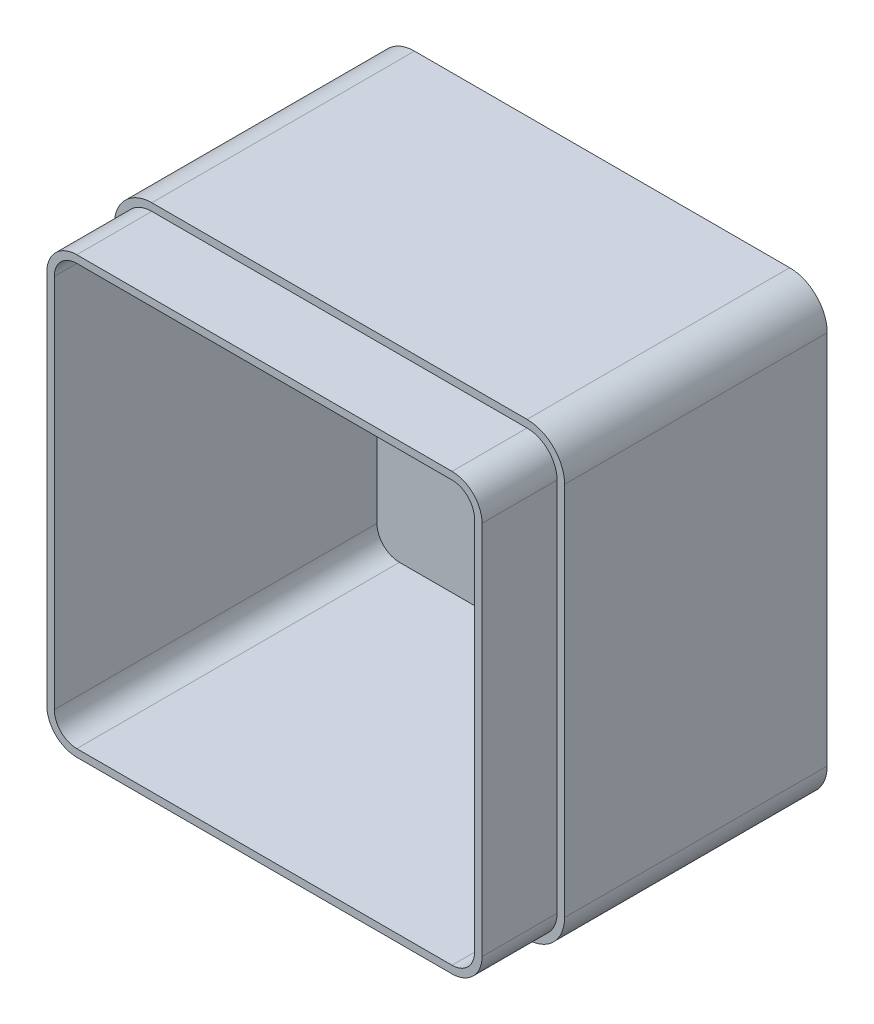
ISO-10303-21;
HEADER;
FILE_DESCRIPTION(('STEP AP214'),'2;1');
FILE_NAME('part.step','',(''),(''),'','','');
FILE_SCHEMA(('AUTOMOTIVE_DESIGN { 1 0 10303 214 1 1 1 1 }'));
ENDSEC;
DATA;
#1=APPLICATION_CONTEXT('core data for automotive mechanical design processes');
#2=APPLICATION_PROTOCOL_DEFINITION('international standard','automotive_design',2000,#1);
#3=PRODUCT_CONTEXT('',#1,'mechanical');
#4=PRODUCT('Part','Part','',(#3));
#5=PRODUCT_RELATED_PRODUCT_CATEGORY('part','',(#4));
#6=PRODUCT_DEFINITION_FORMATION('','',#4);
#7=PRODUCT_DEFINITION_CONTEXT('part definition',#1,'design');
#8=PRODUCT_DEFINITION('design','',#6,#7);
#9=PRODUCT_DEFINITION_SHAPE('','',#8);
#10=(LENGTH_UNIT() NAMED_UNIT(*) SI_UNIT(.MILLI.,.METRE.));
#11=(NAMED_UNIT(*) PLANE_ANGLE_UNIT() SI_UNIT($,.RADIAN.));
#12=(NAMED_UNIT(*) SI_UNIT($,.STERADIAN.) SOLID_ANGLE_UNIT());
#13=UNCERTAINTY_MEASURE_WITH_UNIT(LENGTH_MEASURE(1.E-05),#10,'distance_accuracy_value','');
#14=(GEOMETRIC_REPRESENTATION_CONTEXT(3) GLOBAL_UNCERTAINTY_ASSIGNED_CONTEXT((#13)) GLOBAL_UNIT_ASSIGNED_CONTEXT((#10,
#11,#12)) REPRESENTATION_CONTEXT('',''));
#15=CARTESIAN_POINT('',(0.,0.,0.));
#16=DIRECTION('',(0.,0.,1.));
#17=DIRECTION('',(1.,0.,0.));
#18=AXIS2_PLACEMENT_3D('',#15,#16,#17);
#19=CARTESIAN_POINT('',(0.,0.,90.));
#20=DIRECTION('',(0.,0.,-1.));
#21=DIRECTION('',(-1.,0.,0.));
#22=AXIS2_PLACEMENT_3D('',#19,#20,#21);
#23=PLANE('',#22);
#24=DIRECTION('',(1.,0.,0.));
#25=VECTOR('',#24,1.);
#26=CARTESIAN_POINT('',(0.,4.,90.));
#27=LINE('',#26,#25);
#28=CARTESIAN_POINT('',(10.,4.,90.));
#29=VERTEX_POINT('',#28);
#30=CARTESIAN_POINT('',(110.,4.00000000000001,90.));
#31=VERTEX_POINT('',#30);
#32=EDGE_CURVE('E329',#29,#31,#27,.T.);
#33=ORIENTED_EDGE('',*,*,#32,.F.);
#34=CARTESIAN_POINT('',(9.99999999999999,10.,90.));
#35=DIRECTION('',(0.,0.,-1.));
#36=DIRECTION('',(-1.,0.,0.));
#37=AXIS2_PLACEMENT_3D('',#34,#35,#36);
#38=CIRCLE('',#37,6.);
#39=CARTESIAN_POINT('',(4.,10.,90.));
#40=VERTEX_POINT('',#39);
#41=EDGE_CURVE('E330',#40,#29,#38,.F.);
#42=ORIENTED_EDGE('',*,*,#41,.F.);
#43=DIRECTION('',(0.,-1.,0.));
#44=VECTOR('',#43,1.);
#45=CARTESIAN_POINT('',(4.,0.,90.));
#46=LINE('',#45,#44);
#47=CARTESIAN_POINT('',(3.99999999999997,110.,90.));
#48=VERTEX_POINT('',#47);
#49=EDGE_CURVE('E310',#48,#40,#46,.T.);
#50=ORIENTED_EDGE('',*,*,#49,.F.);
#51=CARTESIAN_POINT('',(9.99999999999997,110.,90.));
#52=DIRECTION('',(0.,0.,-1.));
#53=DIRECTION('',(-1.,0.,0.));
#54=AXIS2_PLACEMENT_3D('',#51,#52,#53);
#55=CIRCLE('',#54,6.);
#56=CARTESIAN_POINT('',(9.99999999999997,116.,90.));
#57=VERTEX_POINT('',#56);
#58=EDGE_CURVE('E332',#57,#48,#55,.F.);
#59=ORIENTED_EDGE('',*,*,#58,.F.);
#60=DIRECTION('',(-1.,0.,0.));
#61=VECTOR('',#60,1.);
#62=CARTESIAN_POINT('',(0.,116.,90.));
#63=LINE('',#62,#61);
#64=CARTESIAN_POINT('',(110.,116.,90.));
#65=VERTEX_POINT('',#64);
#66=EDGE_CURVE('E322',#65,#57,#63,.T.);
#67=ORIENTED_EDGE('',*,*,#66,.F.);
#68=CARTESIAN_POINT('',(110.,110.,90.));
#69=DIRECTION('',(0.,0.,-1.));
#70=DIRECTION('',(-1.,0.,0.));
#71=AXIS2_PLACEMENT_3D('',#68,#69,#70);
#72=CIRCLE('',#71,6.);
#73=CARTESIAN_POINT('',(116.,110.,90.));
#74=VERTEX_POINT('',#73);
#75=EDGE_CURVE('E315',#74,#65,#72,.F.);
#76=ORIENTED_EDGE('',*,*,#75,.F.);
#77=DIRECTION('',(0.,1.,0.));
#78=VECTOR('',#77,1.);
#79=CARTESIAN_POINT('',(116.,0.,90.));
#80=LINE('',#79,#78);
#81=CARTESIAN_POINT('',(116.,10.,90.));
#82=VERTEX_POINT('',#81);
#83=EDGE_CURVE('E335',#82,#74,#80,.T.);
#84=ORIENTED_EDGE('',*,*,#83,.F.);
#85=CARTESIAN_POINT('',(110.,10.,90.));
#86=DIRECTION('',(0.,0.,-1.));
#87=DIRECTION('',(-1.,0.,0.));
#88=AXIS2_PLACEMENT_3D('',#85,#86,#87);
#89=CIRCLE('',#88,6.);
#90=EDGE_CURVE('E293',#31,#82,#89,.F.);
#91=ORIENTED_EDGE('',*,*,#90,.F.);
#92=EDGE_LOOP('',(#33,#42,#50,#59,#67,#76,#84,#91));
#93=FACE_BOUND('',#92,.T.);
#94=CARTESIAN_POINT('',(9.99999999999999,10.,90.));
#95=DIRECTION('',(0.,0.,1.));
#96=DIRECTION('',(1.,0.,0.));
#97=AXIS2_PLACEMENT_3D('',#94,#95,#96);
#98=CIRCLE('',#97,7.99999999999999);
#99=CARTESIAN_POINT('',(2.00000000000001,9.99999999999999,90.));
#100=VERTEX_POINT('',#99);
#101=CARTESIAN_POINT('',(10.,2.,90.));
#102=VERTEX_POINT('',#101);
#103=EDGE_CURVE('E240',#100,#102,#98,.T.);
#104=ORIENTED_EDGE('',*,*,#103,.T.);
#105=DIRECTION('',(1.,0.,0.));
#106=VECTOR('',#105,1.);
#107=CARTESIAN_POINT('',(10.,2.,90.));
#108=LINE('',#107,#106);
#109=CARTESIAN_POINT('',(110.,2.00000000000001,90.));
#110=VERTEX_POINT('',#109);
#111=EDGE_CURVE('E200',#102,#110,#108,.T.);
#112=ORIENTED_EDGE('',*,*,#111,.T.);
#113=CARTESIAN_POINT('',(110.,10.,90.));
#114=DIRECTION('',(0.,0.,1.));
#115=DIRECTION('',(1.,0.,0.));
#116=AXIS2_PLACEMENT_3D('',#113,#114,#115);
#117=CIRCLE('',#116,8.);
#118=CARTESIAN_POINT('',(118.,10.,90.));
#119=VERTEX_POINT('',#118);
#120=EDGE_CURVE('E48',#110,#119,#117,.T.);
#121=ORIENTED_EDGE('',*,*,#120,.T.);
#122=DIRECTION('',(0.,1.,0.));
#123=VECTOR('',#122,1.);
#124=CARTESIAN_POINT('',(118.,10.,90.));
#125=LINE('',#124,#123);
#126=CARTESIAN_POINT('',(118.,110.,90.));
#127=VERTEX_POINT('',#126);
#128=EDGE_CURVE('E244',#119,#127,#125,.T.);
#129=ORIENTED_EDGE('',*,*,#128,.T.);
#130=CARTESIAN_POINT('',(110.,110.,90.));
#131=DIRECTION('',(0.,0.,1.));
#132=DIRECTION('',(1.,0.,0.));
#133=AXIS2_PLACEMENT_3D('',#130,#131,#132);
#134=CIRCLE('',#133,8.00000000000001);
#135=CARTESIAN_POINT('',(110.,118.,90.));
#136=VERTEX_POINT('',#135);
#137=EDGE_CURVE('E247',#127,#136,#134,.T.);
#138=ORIENTED_EDGE('',*,*,#137,.T.);
#139=DIRECTION('',(-1.,0.,0.));
#140=VECTOR('',#139,1.);
#141=CARTESIAN_POINT('',(110.,118.,90.));
#142=LINE('',#141,#140);
#143=CARTESIAN_POINT('',(9.99999999999997,118.,90.));
#144=VERTEX_POINT('',#143);
#145=EDGE_CURVE('E250',#136,#144,#142,.T.);
#146=ORIENTED_EDGE('',*,*,#145,.T.);
#147=CARTESIAN_POINT('',(9.99999999999997,110.,90.));
#148=DIRECTION('',(0.,0.,1.));
#149=DIRECTION('',(1.,0.,0.));
#150=AXIS2_PLACEMENT_3D('',#147,#148,#149);
#151=CIRCLE('',#150,7.99999999999999);
#152=CARTESIAN_POINT('',(1.99999999999998,110.,90.));
#153=VERTEX_POINT('',#152);
#154=EDGE_CURVE('E223',#144,#153,#151,.T.);
#155=ORIENTED_EDGE('',*,*,#154,.T.);
#156=DIRECTION('',(0.,-1.,0.));
#157=VECTOR('',#156,1.);
#158=CARTESIAN_POINT('',(1.99999999999998,110.,90.));
#159=LINE('',#158,#157);
#160=EDGE_CURVE('E220',#153,#100,#159,.T.);
#161=ORIENTED_EDGE('',*,*,#160,.T.);
#162=EDGE_LOOP('',(#104,#112,#121,#129,#138,#146,#155,#161));
#163=FACE_BOUND('',#162,.T.);
#164=ADVANCED_FACE('F33',(#93,#163),#23,.F.);
#165=CARTESIAN_POINT('',(4.,0.,90.));
#166=DIRECTION('',(1.,0.,0.));
#167=DIRECTION('',(0.,1.,0.));
#168=AXIS2_PLACEMENT_3D('',#165,#166,#167);
#169=PLANE('',#168);
#170=DIRECTION('',(0.,-1.,0.));
#171=VECTOR('',#170,1.);
#172=CARTESIAN_POINT('',(4.,0.,4.));
#173=LINE('',#172,#171);
#174=CARTESIAN_POINT('',(3.99999999999997,110.,4.));
#175=VERTEX_POINT('',#174);
#176=CARTESIAN_POINT('',(4.,10.,4.));
#177=VERTEX_POINT('',#176);
#178=EDGE_CURVE('E282',#175,#177,#173,.T.);
#179=ORIENTED_EDGE('',*,*,#178,.F.);
#180=DIRECTION('',(0.,0.,1.));
#181=VECTOR('',#180,1.);
#182=CARTESIAN_POINT('',(3.99999999999997,110.,90.));
#183=LINE('',#182,#181);
#184=EDGE_CURVE('E290',#48,#175,#183,.F.);
#185=ORIENTED_EDGE('',*,*,#184,.F.);
#186=ORIENTED_EDGE('',*,*,#49,.T.);
#187=DIRECTION('',(0.,0.,1.));
#188=VECTOR('',#187,1.);
#189=CARTESIAN_POINT('',(4.,10.,90.));
#190=LINE('',#189,#188);
#191=EDGE_CURVE('E286',#177,#40,#190,.T.);
#192=ORIENTED_EDGE('',*,*,#191,.F.);
#193=EDGE_LOOP('',(#179,#185,#186,#192));
#194=FACE_BOUND('',#193,.T.);
#195=ADVANCED_FACE('F426',(#194),#169,.T.);
#196=CARTESIAN_POINT('',(0.,4.,90.));
#197=DIRECTION('',(0.,1.,0.));
#198=DIRECTION('',(-1.,0.,0.));
#199=AXIS2_PLACEMENT_3D('',#196,#197,#198);
#200=PLANE('',#199);
#201=DIRECTION('',(1.,0.,0.));
#202=VECTOR('',#201,1.);
#203=CARTESIAN_POINT('',(0.,4.,4.));
#204=LINE('',#203,#202);
#205=CARTESIAN_POINT('',(10.,4.,4.));
#206=VERTEX_POINT('',#205);
#207=CARTESIAN_POINT('',(110.,4.00000000000001,4.));
#208=VERTEX_POINT('',#207);
#209=EDGE_CURVE('E285',#206,#208,#204,.T.);
#210=ORIENTED_EDGE('',*,*,#209,.F.);
#211=DIRECTION('',(0.,0.,1.));
#212=VECTOR('',#211,1.);
#213=CARTESIAN_POINT('',(10.,4.,90.));
#214=LINE('',#213,#212);
#215=EDGE_CURVE('E300',#29,#206,#214,.F.);
#216=ORIENTED_EDGE('',*,*,#215,.F.);
#217=ORIENTED_EDGE('',*,*,#32,.T.);
#218=DIRECTION('',(0.,0.,1.));
#219=VECTOR('',#218,1.);
#220=CARTESIAN_POINT('',(110.,4.00000000000001,90.));
#221=LINE('',#220,#219);
#222=EDGE_CURVE('E313',#208,#31,#221,.T.);
#223=ORIENTED_EDGE('',*,*,#222,.F.);
#224=EDGE_LOOP('',(#210,#216,#217,#223));
#225=FACE_BOUND('',#224,.T.);
#226=ADVANCED_FACE('F432',(#225),#200,.T.);
#227=CARTESIAN_POINT('',(116.,0.,90.));
#228=DIRECTION('',(-1.,0.,0.));
#229=DIRECTION('',(0.,-1.,0.));
#230=AXIS2_PLACEMENT_3D('',#227,#228,#229);
#231=PLANE('',#230);
#232=ORIENTED_EDGE('',*,*,#83,.T.);
#233=DIRECTION('',(0.,0.,1.));
#234=VECTOR('',#233,1.);
#235=CARTESIAN_POINT('',(116.,110.,90.));
#236=LINE('',#235,#234);
#237=CARTESIAN_POINT('',(116.,110.,4.));
#238=VERTEX_POINT('',#237);
#239=EDGE_CURVE('E320',#238,#74,#236,.T.);
#240=ORIENTED_EDGE('',*,*,#239,.F.);
#241=DIRECTION('',(0.,1.,0.));
#242=VECTOR('',#241,1.);
#243=CARTESIAN_POINT('',(116.,0.,4.));
#244=LINE('',#243,#242);
#245=CARTESIAN_POINT('',(116.,10.,4.));
#246=VERTEX_POINT('',#245);
#247=EDGE_CURVE('E294',#246,#238,#244,.T.);
#248=ORIENTED_EDGE('',*,*,#247,.F.);
#249=DIRECTION('',(0.,0.,1.));
#250=VECTOR('',#249,1.);
#251=CARTESIAN_POINT('',(116.,10.,90.));
#252=LINE('',#251,#250);
#253=EDGE_CURVE('E312',#82,#246,#252,.F.);
#254=ORIENTED_EDGE('',*,*,#253,.F.);
#255=EDGE_LOOP('',(#232,#240,#248,#254));
#256=FACE_BOUND('',#255,.T.);
#257=ADVANCED_FACE('F626',(#256),#231,.T.);
#258=CARTESIAN_POINT('',(0.,116.,90.));
#259=DIRECTION('',(0.,-1.,0.));
#260=DIRECTION('',(0.,0.,-1.));
#261=AXIS2_PLACEMENT_3D('',#258,#259,#260);
#262=PLANE('',#261);
#263=DIRECTION('',(-1.,0.,0.));
#264=VECTOR('',#263,1.);
#265=CARTESIAN_POINT('',(0.,116.,4.));
#266=LINE('',#265,#264);
#267=CARTESIAN_POINT('',(110.,116.,4.));
#268=VERTEX_POINT('',#267);
#269=CARTESIAN_POINT('',(9.99999999999997,116.,4.));
#270=VERTEX_POINT('',#269);
#271=EDGE_CURVE('E297',#268,#270,#266,.T.);
#272=ORIENTED_EDGE('',*,*,#271,.F.);
#273=DIRECTION('',(0.,0.,-1.));
#274=VECTOR('',#273,1.);
#275=CARTESIAN_POINT('',(110.,116.,90.));
#276=LINE('',#275,#274);
#277=EDGE_CURVE('E289',#65,#268,#276,.T.);
#278=ORIENTED_EDGE('',*,*,#277,.F.);
#279=ORIENTED_EDGE('',*,*,#66,.T.);
#280=DIRECTION('',(0.,0.,-1.));
#281=VECTOR('',#280,1.);
#282=CARTESIAN_POINT('',(9.99999999999997,116.,90.));
#283=LINE('',#282,#281);
#284=EDGE_CURVE('E325',#270,#57,#283,.F.);
#285=ORIENTED_EDGE('',*,*,#284,.F.);
#286=EDGE_LOOP('',(#272,#278,#279,#285));
#287=FACE_BOUND('',#286,.T.);
#288=ADVANCED_FACE('F616',(#287),#262,.T.);
#289=CARTESIAN_POINT('',(0.,0.,4.));
#290=DIRECTION('',(0.,0.,-1.));
#291=DIRECTION('',(-1.,0.,0.));
#292=AXIS2_PLACEMENT_3D('',#289,#290,#291);
#293=PLANE('',#292);
#294=ORIENTED_EDGE('',*,*,#247,.T.);
#295=CARTESIAN_POINT('',(110.,110.,4.));
#296=DIRECTION('',(0.,0.,-1.));
#297=DIRECTION('',(-1.,0.,0.));
#298=AXIS2_PLACEMENT_3D('',#295,#296,#297);
#299=CIRCLE('',#298,6.);
#300=EDGE_CURVE('E307',#268,#238,#299,.T.);
#301=ORIENTED_EDGE('',*,*,#300,.F.);
#302=ORIENTED_EDGE('',*,*,#271,.T.);
#303=CARTESIAN_POINT('',(9.99999999999997,110.,4.));
#304=DIRECTION('',(0.,0.,-1.));
#305=DIRECTION('',(-1.,0.,0.));
#306=AXIS2_PLACEMENT_3D('',#303,#304,#305);
#307=CIRCLE('',#306,6.);
#308=EDGE_CURVE('E305',#175,#270,#307,.T.);
#309=ORIENTED_EDGE('',*,*,#308,.F.);
#310=ORIENTED_EDGE('',*,*,#178,.T.);
#311=CARTESIAN_POINT('',(9.99999999999999,10.,4.));
#312=DIRECTION('',(0.,0.,-1.));
#313=DIRECTION('',(-1.,0.,0.));
#314=AXIS2_PLACEMENT_3D('',#311,#312,#313);
#315=CIRCLE('',#314,6.);
#316=EDGE_CURVE('E301',#206,#177,#315,.T.);
#317=ORIENTED_EDGE('',*,*,#316,.F.);
#318=ORIENTED_EDGE('',*,*,#209,.T.);
#319=CARTESIAN_POINT('',(110.,10.,4.));
#320=DIRECTION('',(0.,0.,-1.));
#321=DIRECTION('',(-1.,0.,0.));
#322=AXIS2_PLACEMENT_3D('',#319,#320,#321);
#323=CIRCLE('',#322,6.);
#324=EDGE_CURVE('E298',#246,#208,#323,.T.);
#325=ORIENTED_EDGE('',*,*,#324,.F.);
#326=EDGE_LOOP('',(#294,#301,#302,#309,#310,#317,#318,#325));
#327=FACE_BOUND('',#326,.T.);
#328=ADVANCED_FACE('F606',(#327),#293,.F.);
#329=CARTESIAN_POINT('',(110.,10.,90.));
#330=DIRECTION('',(0.,0.,-1.));
#331=DIRECTION('',(-1.,0.,0.));
#332=AXIS2_PLACEMENT_3D('',#329,#330,#331);
#333=CYLINDRICAL_SURFACE('',#332,6.);
#334=ORIENTED_EDGE('',*,*,#90,.T.);
#335=ORIENTED_EDGE('',*,*,#253,.T.);
#336=ORIENTED_EDGE('',*,*,#324,.T.);
#337=ORIENTED_EDGE('',*,*,#222,.T.);
#338=EDGE_LOOP('',(#334,#335,#336,#337));
#339=FACE_BOUND('',#338,.T.);
#340=ADVANCED_FACE('F596',(#339),#333,.F.);
#341=CARTESIAN_POINT('',(9.99999999999999,10.,90.));
#342=DIRECTION('',(0.,0.,-1.));
#343=DIRECTION('',(-1.,0.,0.));
#344=AXIS2_PLACEMENT_3D('',#341,#342,#343);
#345=CYLINDRICAL_SURFACE('',#344,6.);
#346=ORIENTED_EDGE('',*,*,#41,.T.);
#347=ORIENTED_EDGE('',*,*,#215,.T.);
#348=ORIENTED_EDGE('',*,*,#316,.T.);
#349=ORIENTED_EDGE('',*,*,#191,.T.);
#350=EDGE_LOOP('',(#346,#347,#348,#349));
#351=FACE_BOUND('',#350,.T.);
#352=ADVANCED_FACE('F587',(#351),#345,.F.);
#353=CARTESIAN_POINT('',(9.99999999999997,110.,90.));
#354=DIRECTION('',(0.,0.,-1.));
#355=DIRECTION('',(-1.,0.,0.));
#356=AXIS2_PLACEMENT_3D('',#353,#354,#355);
#357=CYLINDRICAL_SURFACE('',#356,6.);
#358=ORIENTED_EDGE('',*,*,#58,.T.);
#359=ORIENTED_EDGE('',*,*,#184,.T.);
#360=ORIENTED_EDGE('',*,*,#308,.T.);
#361=ORIENTED_EDGE('',*,*,#284,.T.);
#362=EDGE_LOOP('',(#358,#359,#360,#361));
#363=FACE_BOUND('',#362,.T.);
#364=ADVANCED_FACE('F578',(#363),#357,.F.);
#365=CARTESIAN_POINT('',(110.,110.,90.));
#366=DIRECTION('',(0.,0.,-1.));
#367=DIRECTION('',(-1.,0.,0.));
#368=AXIS2_PLACEMENT_3D('',#365,#366,#367);
#369=CYLINDRICAL_SURFACE('',#368,6.);
#370=ORIENTED_EDGE('',*,*,#75,.T.);
#371=ORIENTED_EDGE('',*,*,#277,.T.);
#372=ORIENTED_EDGE('',*,*,#300,.T.);
#373=ORIENTED_EDGE('',*,*,#239,.T.);
#374=EDGE_LOOP('',(#370,#371,#372,#373));
#375=FACE_BOUND('',#374,.T.);
#376=ADVANCED_FACE('F439',(#375),#369,.F.);
#377=CARTESIAN_POINT('',(9.99999999999999,10.,70.));
#378=DIRECTION('',(0.,0.,1.));
#379=DIRECTION('',(1.,0.,0.));
#380=AXIS2_PLACEMENT_3D('',#377,#378,#379);
#381=PLANE('',#380);
#382=DIRECTION('',(0.,-1.,0.));
#383=VECTOR('',#382,1.);
#384=CARTESIAN_POINT('',(1.99999999999998,110.,70.));
#385=LINE('',#384,#383);
#386=CARTESIAN_POINT('',(1.99999999999998,110.,70.));
#387=VERTEX_POINT('',#386);
#388=CARTESIAN_POINT('',(2.00000000000001,9.99999999999999,70.));
#389=VERTEX_POINT('',#388);
#390=EDGE_CURVE('E206',#387,#389,#385,.T.);
#391=ORIENTED_EDGE('',*,*,#390,.F.);
#392=CARTESIAN_POINT('',(9.99999999999997,110.,70.));
#393=DIRECTION('',(0.,0.,1.));
#394=DIRECTION('',(1.,0.,0.));
#395=AXIS2_PLACEMENT_3D('',#392,#393,#394);
#396=CIRCLE('',#395,7.99999999999999);
#397=CARTESIAN_POINT('',(9.99999999999997,118.,70.));
#398=VERTEX_POINT('',#397);
#399=EDGE_CURVE('E236',#398,#387,#396,.T.);
#400=ORIENTED_EDGE('',*,*,#399,.F.);
#401=DIRECTION('',(-1.,0.,0.));
#402=VECTOR('',#401,1.);
#403=CARTESIAN_POINT('',(110.,118.,70.));
#404=LINE('',#403,#402);
#405=CARTESIAN_POINT('',(110.,118.,70.));
#406=VERTEX_POINT('',#405);
#407=EDGE_CURVE('E233',#406,#398,#404,.T.);
#408=ORIENTED_EDGE('',*,*,#407,.F.);
#409=CARTESIAN_POINT('',(110.,110.,70.));
#410=DIRECTION('',(0.,0.,1.));
#411=DIRECTION('',(1.,0.,0.));
#412=AXIS2_PLACEMENT_3D('',#409,#410,#411);
#413=CIRCLE('',#412,8.00000000000001);
#414=CARTESIAN_POINT('',(118.,110.,70.));
#415=VERTEX_POINT('',#414);
#416=EDGE_CURVE('E230',#415,#406,#413,.T.);
#417=ORIENTED_EDGE('',*,*,#416,.F.);
#418=DIRECTION('',(0.,1.,0.));
#419=VECTOR('',#418,1.);
#420=CARTESIAN_POINT('',(118.,10.,70.));
#421=LINE('',#420,#419);
#422=CARTESIAN_POINT('',(118.,10.,70.));
#423=VERTEX_POINT('',#422);
#424=EDGE_CURVE('E227',#423,#415,#421,.T.);
#425=ORIENTED_EDGE('',*,*,#424,.F.);
#426=CARTESIAN_POINT('',(110.,10.,70.));
#427=DIRECTION('',(0.,0.,1.));
#428=DIRECTION('',(1.,0.,0.));
#429=AXIS2_PLACEMENT_3D('',#426,#427,#428);
#430=CIRCLE('',#429,8.);
#431=CARTESIAN_POINT('',(110.,2.00000000000001,70.));
#432=VERTEX_POINT('',#431);
#433=EDGE_CURVE('E216',#432,#423,#430,.T.);
#434=ORIENTED_EDGE('',*,*,#433,.F.);
#435=DIRECTION('',(1.,0.,0.));
#436=VECTOR('',#435,1.);
#437=CARTESIAN_POINT('',(10.,2.,70.));
#438=LINE('',#437,#436);
#439=CARTESIAN_POINT('',(10.,2.,70.));
#440=VERTEX_POINT('',#439);
#441=EDGE_CURVE('E198',#440,#432,#438,.T.);
#442=ORIENTED_EDGE('',*,*,#441,.F.);
#443=CARTESIAN_POINT('',(9.99999999999999,10.,70.));
#444=DIRECTION('',(0.,0.,1.));
#445=DIRECTION('',(1.,0.,0.));
#446=AXIS2_PLACEMENT_3D('',#443,#444,#445);
#447=CIRCLE('',#446,7.99999999999999);
#448=EDGE_CURVE('E212',#389,#440,#447,.T.);
#449=ORIENTED_EDGE('',*,*,#448,.F.);
#450=EDGE_LOOP('',(#391,#400,#408,#417,#425,#434,#442,#449));
#451=FACE_BOUND('',#450,.T.);
#452=CARTESIAN_POINT('',(9.99999999999999,10.,70.));
#453=DIRECTION('',(0.,0.,1.));
#454=DIRECTION('',(1.,0.,0.));
#455=AXIS2_PLACEMENT_3D('',#452,#453,#454);
#456=CIRCLE('',#455,10.);
#457=CARTESIAN_POINT('',(0.,9.99999999999999,70.));
#458=VERTEX_POINT('',#457);
#459=CARTESIAN_POINT('',(10.,0.,70.));
#460=VERTEX_POINT('',#459);
#461=EDGE_CURVE('E256',#458,#460,#456,.T.);
#462=ORIENTED_EDGE('',*,*,#461,.T.);
#463=DIRECTION('',(1.,0.,0.));
#464=VECTOR('',#463,1.);
#465=CARTESIAN_POINT('',(10.,0.,70.));
#466=LINE('',#465,#464);
#467=CARTESIAN_POINT('',(110.,0.,70.));
#468=VERTEX_POINT('',#467);
#469=EDGE_CURVE('E269',#460,#468,#466,.T.);
#470=ORIENTED_EDGE('',*,*,#469,.T.);
#471=CARTESIAN_POINT('',(110.,10.,70.));
#472=DIRECTION('',(0.,0.,1.));
#473=DIRECTION('',(1.,0.,0.));
#474=AXIS2_PLACEMENT_3D('',#471,#472,#473);
#475=CIRCLE('',#474,9.99999999999999);
#476=CARTESIAN_POINT('',(120.,10.,70.));
#477=VERTEX_POINT('',#476);
#478=EDGE_CURVE('E271',#468,#477,#475,.T.);
#479=ORIENTED_EDGE('',*,*,#478,.T.);
#480=DIRECTION('',(0.,1.,0.));
#481=VECTOR('',#480,1.);
#482=CARTESIAN_POINT('',(120.,10.,70.));
#483=LINE('',#482,#481);
#484=CARTESIAN_POINT('',(120.,110.,70.));
#485=VERTEX_POINT('',#484);
#486=EDGE_CURVE('E56',#477,#485,#483,.T.);
#487=ORIENTED_EDGE('',*,*,#486,.T.);
#488=CARTESIAN_POINT('',(110.,110.,70.));
#489=DIRECTION('',(0.,0.,1.));
#490=DIRECTION('',(1.,0.,0.));
#491=AXIS2_PLACEMENT_3D('',#488,#489,#490);
#492=CIRCLE('',#491,9.99999999999999);
#493=CARTESIAN_POINT('',(110.,120.,70.));
#494=VERTEX_POINT('',#493);
#495=EDGE_CURVE('E274',#485,#494,#492,.T.);
#496=ORIENTED_EDGE('',*,*,#495,.T.);
#497=DIRECTION('',(-1.,0.,0.));
#498=VECTOR('',#497,1.);
#499=CARTESIAN_POINT('',(110.,120.,70.));
#500=LINE('',#499,#498);
#501=CARTESIAN_POINT('',(9.99999999999997,120.,70.));
#502=VERTEX_POINT('',#501);
#503=EDGE_CURVE('E276',#494,#502,#500,.T.);
#504=ORIENTED_EDGE('',*,*,#503,.T.);
#505=CARTESIAN_POINT('',(9.99999999999997,110.,70.));
#506=DIRECTION('',(0.,0.,1.));
#507=DIRECTION('',(1.,0.,0.));
#508=AXIS2_PLACEMENT_3D('',#505,#506,#507);
#509=CIRCLE('',#508,9.99999999999999);
#510=CARTESIAN_POINT('',(0.,110.,70.));
#511=VERTEX_POINT('',#510);
#512=EDGE_CURVE('E278',#502,#511,#509,.T.);
#513=ORIENTED_EDGE('',*,*,#512,.T.);
#514=DIRECTION('',(0.,-1.,0.));
#515=VECTOR('',#514,1.);
#516=CARTESIAN_POINT('',(0.,110.,70.));
#517=LINE('',#516,#515);
#518=EDGE_CURVE('E280',#511,#458,#517,.T.);
#519=ORIENTED_EDGE('',*,*,#518,.T.);
#520=EDGE_LOOP('',(#462,#470,#479,#487,#496,#504,#513,#519));
#521=FACE_BOUND('',#520,.T.);
#522=ADVANCED_FACE('F211',(#451,#521),#381,.T.);
#523=CARTESIAN_POINT('',(9.99999999999999,10.,70.));
#524=DIRECTION('',(0.,0.,1.));
#525=DIRECTION('',(1.,0.,0.));
#526=AXIS2_PLACEMENT_3D('',#523,#524,#525);
#527=CYLINDRICAL_SURFACE('',#526,7.99999999999999);
#528=ORIENTED_EDGE('',*,*,#103,.F.);
#529=DIRECTION('',(0.,0.,1.));
#530=VECTOR('',#529,1.);
#531=CARTESIAN_POINT('',(2.00000000000001,9.99999999999999,70.));
#532=LINE('',#531,#530);
#533=EDGE_CURVE('E219',#389,#100,#532,.T.);
#534=ORIENTED_EDGE('',*,*,#533,.F.);
#535=ORIENTED_EDGE('',*,*,#448,.T.);
#536=DIRECTION('',(0.,0.,1.));
#537=VECTOR('',#536,1.);
#538=CARTESIAN_POINT('',(10.,2.,70.));
#539=LINE('',#538,#537);
#540=EDGE_CURVE('E195',#440,#102,#539,.T.);
#541=ORIENTED_EDGE('',*,*,#540,.T.);
#542=EDGE_LOOP('',(#528,#534,#535,#541));
#543=FACE_BOUND('',#542,.T.);
#544=ADVANCED_FACE('F218',(#543),#527,.T.);
#545=CARTESIAN_POINT('',(1.99999999999998,110.,70.));
#546=DIRECTION('',(-1.,0.,0.));
#547=DIRECTION('',(0.,-1.,0.));
#548=AXIS2_PLACEMENT_3D('',#545,#546,#547);
#549=PLANE('',#548);
#550=ORIENTED_EDGE('',*,*,#160,.F.);
#551=DIRECTION('',(0.,0.,1.));
#552=VECTOR('',#551,1.);
#553=CARTESIAN_POINT('',(1.99999999999998,110.,70.));
#554=LINE('',#553,#552);
#555=EDGE_CURVE('E257',#387,#153,#554,.T.);
#556=ORIENTED_EDGE('',*,*,#555,.F.);
#557=ORIENTED_EDGE('',*,*,#390,.T.);
#558=ORIENTED_EDGE('',*,*,#533,.T.);
#559=EDGE_LOOP('',(#550,#556,#557,#558));
#560=FACE_BOUND('',#559,.T.);
#561=ADVANCED_FACE('F482',(#560),#549,.T.);
#562=CARTESIAN_POINT('',(9.99999999999997,110.,70.));
#563=DIRECTION('',(0.,0.,1.));
#564=DIRECTION('',(1.,0.,0.));
#565=AXIS2_PLACEMENT_3D('',#562,#563,#564);
#566=CYLINDRICAL_SURFACE('',#565,7.99999999999999);
#567=ORIENTED_EDGE('',*,*,#154,.F.);
#568=DIRECTION('',(0.,0.,1.));
#569=VECTOR('',#568,1.);
#570=CARTESIAN_POINT('',(9.99999999999997,118.,70.));
#571=LINE('',#570,#569);
#572=EDGE_CURVE('E259',#398,#144,#571,.T.);
#573=ORIENTED_EDGE('',*,*,#572,.F.);
#574=ORIENTED_EDGE('',*,*,#399,.T.);
#575=ORIENTED_EDGE('',*,*,#555,.T.);
#576=EDGE_LOOP('',(#567,#573,#574,#575));
#577=FACE_BOUND('',#576,.T.);
#578=ADVANCED_FACE('F490',(#577),#566,.T.);
#579=CARTESIAN_POINT('',(110.,118.,70.));
#580=DIRECTION('',(0.,1.,0.));
#581=DIRECTION('',(0.,0.,1.));
#582=AXIS2_PLACEMENT_3D('',#579,#580,#581);
#583=PLANE('',#582);
#584=ORIENTED_EDGE('',*,*,#145,.F.);
#585=DIRECTION('',(0.,0.,1.));
#586=VECTOR('',#585,1.);
#587=CARTESIAN_POINT('',(110.,118.,70.));
#588=LINE('',#587,#586);
#589=EDGE_CURVE('E261',#406,#136,#588,.T.);
#590=ORIENTED_EDGE('',*,*,#589,.F.);
#591=ORIENTED_EDGE('',*,*,#407,.T.);
#592=ORIENTED_EDGE('',*,*,#572,.T.);
#593=EDGE_LOOP('',(#584,#590,#591,#592));
#594=FACE_BOUND('',#593,.T.);
#595=ADVANCED_FACE('F499',(#594),#583,.T.);
#596=CARTESIAN_POINT('',(110.,110.,70.));
#597=DIRECTION('',(0.,0.,1.));
#598=DIRECTION('',(1.,0.,0.));
#599=AXIS2_PLACEMENT_3D('',#596,#597,#598);
#600=CYLINDRICAL_SURFACE('',#599,8.00000000000001);
#601=ORIENTED_EDGE('',*,*,#137,.F.);
#602=DIRECTION('',(0.,0.,1.));
#603=VECTOR('',#602,1.);
#604=CARTESIAN_POINT('',(118.,110.,70.));
#605=LINE('',#604,#603);
#606=EDGE_CURVE('E263',#415,#127,#605,.T.);
#607=ORIENTED_EDGE('',*,*,#606,.F.);
#608=ORIENTED_EDGE('',*,*,#416,.T.);
#609=ORIENTED_EDGE('',*,*,#589,.T.);
#610=EDGE_LOOP('',(#601,#607,#608,#609));
#611=FACE_BOUND('',#610,.T.);
#612=ADVANCED_FACE('F508',(#611),#600,.T.);
#613=CARTESIAN_POINT('',(118.,10.,70.));
#614=DIRECTION('',(1.,0.,0.));
#615=DIRECTION('',(0.,0.,-1.));
#616=AXIS2_PLACEMENT_3D('',#613,#614,#615);
#617=PLANE('',#616);
#618=ORIENTED_EDGE('',*,*,#128,.F.);
#619=DIRECTION('',(0.,0.,1.));
#620=VECTOR('',#619,1.);
#621=CARTESIAN_POINT('',(118.,10.,70.));
#622=LINE('',#621,#620);
#623=EDGE_CURVE('E265',#423,#119,#622,.T.);
#624=ORIENTED_EDGE('',*,*,#623,.F.);
#625=ORIENTED_EDGE('',*,*,#424,.T.);
#626=ORIENTED_EDGE('',*,*,#606,.T.);
#627=EDGE_LOOP('',(#618,#624,#625,#626));
#628=FACE_BOUND('',#627,.T.);
#629=ADVANCED_FACE('F517',(#628),#617,.T.);
#630=CARTESIAN_POINT('',(110.,10.,70.));
#631=DIRECTION('',(0.,0.,1.));
#632=DIRECTION('',(1.,0.,0.));
#633=AXIS2_PLACEMENT_3D('',#630,#631,#632);
#634=CYLINDRICAL_SURFACE('',#633,8.);
#635=ORIENTED_EDGE('',*,*,#120,.F.);
#636=DIRECTION('',(0.,0.,1.));
#637=VECTOR('',#636,1.);
#638=CARTESIAN_POINT('',(110.,2.00000000000001,70.));
#639=LINE('',#638,#637);
#640=EDGE_CURVE('E205',#432,#110,#639,.T.);
#641=ORIENTED_EDGE('',*,*,#640,.F.);
#642=ORIENTED_EDGE('',*,*,#433,.T.);
#643=ORIENTED_EDGE('',*,*,#623,.T.);
#644=EDGE_LOOP('',(#635,#641,#642,#643));
#645=FACE_BOUND('',#644,.T.);
#646=ADVANCED_FACE('F526',(#645),#634,.T.);
#647=CARTESIAN_POINT('',(10.,2.,70.));
#648=DIRECTION('',(0.,-1.,0.));
#649=DIRECTION('',(1.,0.,0.));
#650=AXIS2_PLACEMENT_3D('',#647,#648,#649);
#651=PLANE('',#650);
#652=ORIENTED_EDGE('',*,*,#111,.F.);
#653=ORIENTED_EDGE('',*,*,#540,.F.);
#654=ORIENTED_EDGE('',*,*,#441,.T.);
#655=ORIENTED_EDGE('',*,*,#640,.T.);
#656=EDGE_LOOP('',(#652,#653,#654,#655));
#657=FACE_BOUND('',#656,.T.);
#658=ADVANCED_FACE('F197',(#657),#651,.T.);
#659=CARTESIAN_POINT('',(0.,0.,0.));
#660=DIRECTION('',(0.,0.,-1.));
#661=DIRECTION('',(-1.,0.,0.));
#662=AXIS2_PLACEMENT_3D('',#659,#660,#661);
#663=PLANE('',#662);
#664=DIRECTION('',(0.,1.,0.));
#665=VECTOR('',#664,1.);
#666=CARTESIAN_POINT('',(120.,0.,0.));
#667=LINE('',#666,#665);
#668=CARTESIAN_POINT('',(120.,10.,0.));
#669=VERTEX_POINT('',#668);
#670=CARTESIAN_POINT('',(120.,110.,0.));
#671=VERTEX_POINT('',#670);
#672=EDGE_CURVE('E348',#669,#671,#667,.T.);
#673=ORIENTED_EDGE('',*,*,#672,.F.);
#674=CARTESIAN_POINT('',(110.,10.,0.));
#675=DIRECTION('',(0.,0.,-1.));
#676=DIRECTION('',(-1.,0.,0.));
#677=AXIS2_PLACEMENT_3D('',#674,#675,#676);
#678=CIRCLE('',#677,10.);
#679=CARTESIAN_POINT('',(110.,0.,0.));
#680=VERTEX_POINT('',#679);
#681=EDGE_CURVE('E365',#669,#680,#678,.T.);
#682=ORIENTED_EDGE('',*,*,#681,.T.);
#683=DIRECTION('',(1.,0.,0.));
#684=VECTOR('',#683,1.);
#685=CARTESIAN_POINT('',(0.,0.,0.));
#686=LINE('',#685,#684);
#687=CARTESIAN_POINT('',(10.,0.,0.));
#688=VERTEX_POINT('',#687);
#689=EDGE_CURVE('E345',#688,#680,#686,.T.);
#690=ORIENTED_EDGE('',*,*,#689,.F.);
#691=CARTESIAN_POINT('',(9.99999999999999,10.,0.));
#692=DIRECTION('',(0.,0.,-1.));
#693=DIRECTION('',(-1.,0.,0.));
#694=AXIS2_PLACEMENT_3D('',#691,#692,#693);
#695=CIRCLE('',#694,10.);
#696=CARTESIAN_POINT('',(0.,9.99999999999999,0.));
#697=VERTEX_POINT('',#696);
#698=EDGE_CURVE('E363',#688,#697,#695,.T.);
#699=ORIENTED_EDGE('',*,*,#698,.T.);
#700=DIRECTION('',(0.,-1.,0.));
#701=VECTOR('',#700,1.);
#702=CARTESIAN_POINT('',(0.,0.,0.));
#703=LINE('',#702,#701);
#704=CARTESIAN_POINT('',(0.,110.,0.));
#705=VERTEX_POINT('',#704);
#706=EDGE_CURVE('E327',#705,#697,#703,.T.);
#707=ORIENTED_EDGE('',*,*,#706,.F.);
#708=CARTESIAN_POINT('',(9.99999999999997,110.,0.));
#709=DIRECTION('',(0.,0.,-1.));
#710=DIRECTION('',(-1.,0.,0.));
#711=AXIS2_PLACEMENT_3D('',#708,#709,#710);
#712=CIRCLE('',#711,10.);
#713=CARTESIAN_POINT('',(9.99999999999997,120.,0.));
#714=VERTEX_POINT('',#713);
#715=EDGE_CURVE('E361',#705,#714,#712,.T.);
#716=ORIENTED_EDGE('',*,*,#715,.T.);
#717=DIRECTION('',(-1.,0.,0.));
#718=VECTOR('',#717,1.);
#719=CARTESIAN_POINT('',(0.,120.,0.));
#720=LINE('',#719,#718);
#721=CARTESIAN_POINT('',(110.,120.,0.));
#722=VERTEX_POINT('',#721);
#723=EDGE_CURVE('E351',#722,#714,#720,.T.);
#724=ORIENTED_EDGE('',*,*,#723,.F.);
#725=CARTESIAN_POINT('',(110.,110.,0.));
#726=DIRECTION('',(0.,0.,-1.));
#727=DIRECTION('',(-1.,0.,0.));
#728=AXIS2_PLACEMENT_3D('',#725,#726,#727);
#729=CIRCLE('',#728,10.);
#730=EDGE_CURVE('E359',#722,#671,#729,.T.);
#731=ORIENTED_EDGE('',*,*,#730,.T.);
#732=EDGE_LOOP('',(#673,#682,#690,#699,#707,#716,#724,#731));
#733=FACE_BOUND('',#732,.T.);
#734=ADVANCED_FACE('F387',(#733),#663,.T.);
#735=CARTESIAN_POINT('',(9.99999999999997,110.,90.));
#736=DIRECTION('',(0.,0.,-1.));
#737=DIRECTION('',(-1.,0.,0.));
#738=AXIS2_PLACEMENT_3D('',#735,#736,#737);
#739=CYLINDRICAL_SURFACE('',#738,10.);
#740=DIRECTION('',(0.,0.,-1.));
#741=VECTOR('',#740,1.);
#742=CARTESIAN_POINT('',(0.,110.,90.));
#743=LINE('',#742,#741);
#744=EDGE_CURVE('E372',#511,#705,#743,.T.);
#745=ORIENTED_EDGE('',*,*,#744,.F.);
#746=ORIENTED_EDGE('',*,*,#512,.F.);
#747=DIRECTION('',(0.,0.,-1.));
#748=VECTOR('',#747,1.);
#749=CARTESIAN_POINT('',(9.99999999999997,120.,90.));
#750=LINE('',#749,#748);
#751=EDGE_CURVE('E11',#714,#502,#750,.F.);
#752=ORIENTED_EDGE('',*,*,#751,.F.);
#753=ORIENTED_EDGE('',*,*,#715,.F.);
#754=EDGE_LOOP('',(#745,#746,#752,#753));
#755=FACE_BOUND('',#754,.T.);
#756=ADVANCED_FACE('F392',(#755),#739,.T.);
#757=CARTESIAN_POINT('',(110.,110.,90.));
#758=DIRECTION('',(0.,0.,-1.));
#759=DIRECTION('',(-1.,0.,0.));
#760=AXIS2_PLACEMENT_3D('',#757,#758,#759);
#761=CYLINDRICAL_SURFACE('',#760,10.);
#762=DIRECTION('',(0.,0.,-1.));
#763=VECTOR('',#762,1.);
#764=CARTESIAN_POINT('',(110.,120.,90.));
#765=LINE('',#764,#763);
#766=EDGE_CURVE('E41',#494,#722,#765,.T.);
#767=ORIENTED_EDGE('',*,*,#766,.F.);
#768=ORIENTED_EDGE('',*,*,#495,.F.);
#769=DIRECTION('',(0.,0.,-1.));
#770=VECTOR('',#769,1.);
#771=CARTESIAN_POINT('',(120.,110.,90.));
#772=LINE('',#771,#770);
#773=EDGE_CURVE('E354',#671,#485,#772,.F.);
#774=ORIENTED_EDGE('',*,*,#773,.F.);
#775=ORIENTED_EDGE('',*,*,#730,.F.);
#776=EDGE_LOOP('',(#767,#768,#774,#775));
#777=FACE_BOUND('',#776,.T.);
#778=ADVANCED_FACE('F35',(#777),#761,.T.);
#779=CARTESIAN_POINT('',(0.,120.,90.));
#780=DIRECTION('',(0.,-1.,0.));
#781=DIRECTION('',(0.,0.,-1.));
#782=AXIS2_PLACEMENT_3D('',#779,#780,#781);
#783=PLANE('',#782);
#784=ORIENTED_EDGE('',*,*,#503,.F.);
#785=ORIENTED_EDGE('',*,*,#766,.T.);
#786=ORIENTED_EDGE('',*,*,#723,.T.);
#787=ORIENTED_EDGE('',*,*,#751,.T.);
#788=EDGE_LOOP('',(#784,#785,#786,#787));
#789=FACE_BOUND('',#788,.T.);
#790=ADVANCED_FACE('F380',(#789),#783,.F.);
#791=CARTESIAN_POINT('',(110.,10.,90.));
#792=DIRECTION('',(0.,0.,-1.));
#793=DIRECTION('',(-1.,0.,0.));
#794=AXIS2_PLACEMENT_3D('',#791,#792,#793);
#795=CYLINDRICAL_SURFACE('',#794,10.);
#796=DIRECTION('',(0.,0.,-1.));
#797=VECTOR('',#796,1.);
#798=CARTESIAN_POINT('',(120.,10.,90.));
#799=LINE('',#798,#797);
#800=EDGE_CURVE('E357',#477,#669,#799,.T.);
#801=ORIENTED_EDGE('',*,*,#800,.F.);
#802=ORIENTED_EDGE('',*,*,#478,.F.);
#803=DIRECTION('',(0.,0.,-1.));
#804=VECTOR('',#803,1.);
#805=CARTESIAN_POINT('',(110.,0.,90.));
#806=LINE('',#805,#804);
#807=EDGE_CURVE('E369',#680,#468,#806,.F.);
#808=ORIENTED_EDGE('',*,*,#807,.F.);
#809=ORIENTED_EDGE('',*,*,#681,.F.);
#810=EDGE_LOOP('',(#801,#802,#808,#809));
#811=FACE_BOUND('',#810,.T.);
#812=ADVANCED_FACE('F412',(#811),#795,.T.);
#813=CARTESIAN_POINT('',(120.,0.,90.));
#814=DIRECTION('',(-1.,0.,0.));
#815=DIRECTION('',(0.,-1.,0.));
#816=AXIS2_PLACEMENT_3D('',#813,#814,#815);
#817=PLANE('',#816);
#818=ORIENTED_EDGE('',*,*,#486,.F.);
#819=ORIENTED_EDGE('',*,*,#800,.T.);
#820=ORIENTED_EDGE('',*,*,#672,.T.);
#821=ORIENTED_EDGE('',*,*,#773,.T.);
#822=EDGE_LOOP('',(#818,#819,#820,#821));
#823=FACE_BOUND('',#822,.T.);
#824=ADVANCED_FACE('F414',(#823),#817,.F.);
#825=CARTESIAN_POINT('',(9.99999999999999,10.,90.));
#826=DIRECTION('',(0.,0.,-1.));
#827=DIRECTION('',(-1.,0.,0.));
#828=AXIS2_PLACEMENT_3D('',#825,#826,#827);
#829=CYLINDRICAL_SURFACE('',#828,10.);
#830=DIRECTION('',(0.,0.,-1.));
#831=VECTOR('',#830,1.);
#832=CARTESIAN_POINT('',(10.,0.,90.));
#833=LINE('',#832,#831);
#834=EDGE_CURVE('E367',#460,#688,#833,.T.);
#835=ORIENTED_EDGE('',*,*,#834,.F.);
#836=ORIENTED_EDGE('',*,*,#461,.F.);
#837=DIRECTION('',(0.,0.,-1.));
#838=VECTOR('',#837,1.);
#839=CARTESIAN_POINT('',(0.,10.,90.));
#840=LINE('',#839,#838);
#841=EDGE_CURVE('E374',#697,#458,#840,.F.);
#842=ORIENTED_EDGE('',*,*,#841,.F.);
#843=ORIENTED_EDGE('',*,*,#698,.F.);
#844=EDGE_LOOP('',(#835,#836,#842,#843));
#845=FACE_BOUND('',#844,.T.);
#846=ADVANCED_FACE('F402',(#845),#829,.T.);
#847=CARTESIAN_POINT('',(0.,0.,90.));
#848=DIRECTION('',(0.,1.,0.));
#849=DIRECTION('',(-1.,0.,0.));
#850=AXIS2_PLACEMENT_3D('',#847,#848,#849);
#851=PLANE('',#850);
#852=ORIENTED_EDGE('',*,*,#469,.F.);
#853=ORIENTED_EDGE('',*,*,#834,.T.);
#854=ORIENTED_EDGE('',*,*,#689,.T.);
#855=ORIENTED_EDGE('',*,*,#807,.T.);
#856=EDGE_LOOP('',(#852,#853,#854,#855));
#857=FACE_BOUND('',#856,.T.);
#858=ADVANCED_FACE('F407',(#857),#851,.F.);
#859=CARTESIAN_POINT('',(0.,0.,90.));
#860=DIRECTION('',(1.,0.,0.));
#861=DIRECTION('',(0.,1.,0.));
#862=AXIS2_PLACEMENT_3D('',#859,#860,#861);
#863=PLANE('',#862);
#864=ORIENTED_EDGE('',*,*,#518,.F.);
#865=ORIENTED_EDGE('',*,*,#744,.T.);
#866=ORIENTED_EDGE('',*,*,#706,.T.);
#867=ORIENTED_EDGE('',*,*,#841,.T.);
#868=EDGE_LOOP('',(#864,#865,#866,#867));
#869=FACE_BOUND('',#868,.T.);
#870=ADVANCED_FACE('F397',(#869),#863,.F.);
#871=CLOSED_SHELL('',(#164,#195,#226,#257,#288,#328,#340,#352,#364,#376,#522,#544,#561,#578,
#595,#612,#629,#646,#658,#734,#756,#778,#790,#812,#824,#846,#858,#870));
#872=MANIFOLD_SOLID_BREP('B2',#871);
#873=ADVANCED_BREP_SHAPE_REPRESENTATION('',(#18,#872),#14);
#874=SHAPE_DEFINITION_REPRESENTATION(#9,#873);
ENDSEC;
END-ISO-10303-21;
